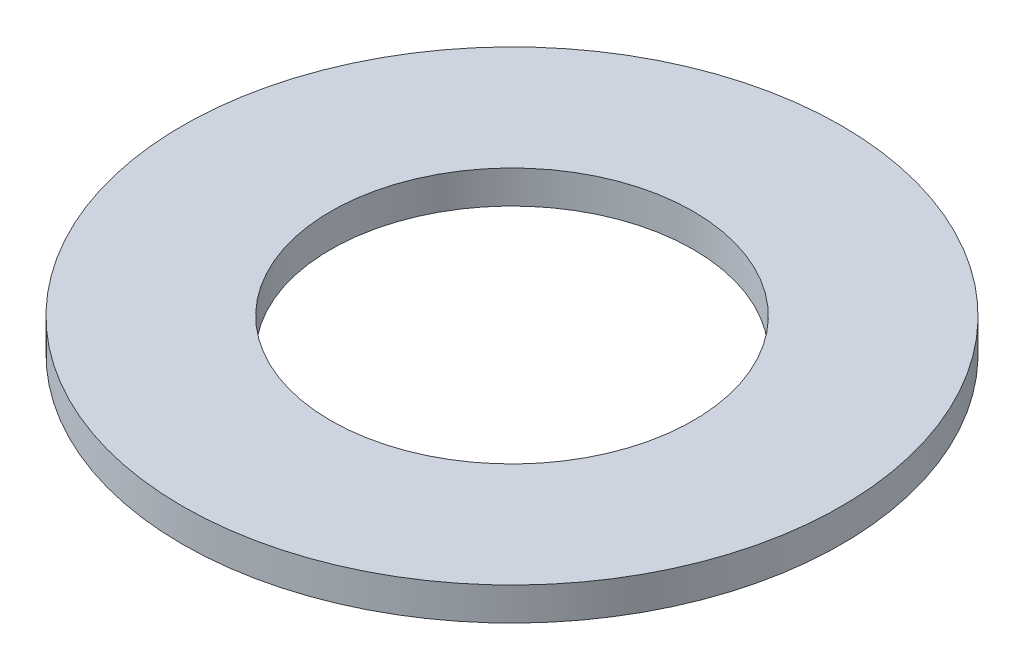
ISO-10303-21;
HEADER;
FILE_DESCRIPTION(('STEP AP214'),'2;1');
FILE_NAME('part.step','',(''),(''),'','','');
FILE_SCHEMA(('AUTOMOTIVE_DESIGN { 1 0 10303 214 1 1 1 1 }'));
ENDSEC;
DATA;
#1=APPLICATION_CONTEXT('core data for automotive mechanical design processes');
#2=APPLICATION_PROTOCOL_DEFINITION('international standard','automotive_design',2000,#1);
#3=PRODUCT_CONTEXT('',#1,'mechanical');
#4=PRODUCT('Part','Part','',(#3));
#5=PRODUCT_RELATED_PRODUCT_CATEGORY('part','',(#4));
#6=PRODUCT_DEFINITION_FORMATION('','',#4);
#7=PRODUCT_DEFINITION_CONTEXT('part definition',#1,'design');
#8=PRODUCT_DEFINITION('design','',#6,#7);
#9=PRODUCT_DEFINITION_SHAPE('','',#8);
#10=(LENGTH_UNIT() NAMED_UNIT(*) SI_UNIT(.MILLI.,.METRE.));
#11=(NAMED_UNIT(*) PLANE_ANGLE_UNIT() SI_UNIT($,.RADIAN.));
#12=(NAMED_UNIT(*) SI_UNIT($,.STERADIAN.) SOLID_ANGLE_UNIT());
#13=UNCERTAINTY_MEASURE_WITH_UNIT(LENGTH_MEASURE(1.E-05),#10,'distance_accuracy_value','');
#14=(GEOMETRIC_REPRESENTATION_CONTEXT(3) GLOBAL_UNCERTAINTY_ASSIGNED_CONTEXT((#13)) GLOBAL_UNIT_ASSIGNED_CONTEXT((#10,
#11,#12)) REPRESENTATION_CONTEXT('',''));
#15=CARTESIAN_POINT('',(0.,0.,0.));
#16=DIRECTION('',(0.,0.,1.));
#17=DIRECTION('',(1.,0.,0.));
#18=AXIS2_PLACEMENT_3D('',#15,#16,#17);
#19=CARTESIAN_POINT('',(0.,2.,0.));
#20=DIRECTION('',(0.,1.,0.));
#21=DIRECTION('',(0.,0.,1.));
#22=AXIS2_PLACEMENT_3D('',#19,#20,#21);
#23=PLANE('',#22);
#24=CARTESIAN_POINT('',(0.,2.,0.));
#25=DIRECTION('',(0.,1.,0.));
#26=DIRECTION('',(0.,0.,1.));
#27=AXIS2_PLACEMENT_3D('',#24,#25,#26);
#28=CIRCLE('',#27,20.);
#29=CARTESIAN_POINT('',(0.,2.,20.));
#30=VERTEX_POINT('',#29);
#31=EDGE_CURVE('E10',#30,#30,#28,.T.);
#32=ORIENTED_EDGE('',*,*,#31,.T.);
#33=EDGE_LOOP('',(#32));
#34=FACE_BOUND('',#33,.T.);
#35=CARTESIAN_POINT('',(0.,2.,0.));
#36=DIRECTION('',(0.,1.,0.));
#37=DIRECTION('',(0.,0.,1.));
#38=AXIS2_PLACEMENT_3D('',#35,#36,#37);
#39=CIRCLE('',#38,11.);
#40=CARTESIAN_POINT('',(0.,2.,11.));
#41=VERTEX_POINT('',#40);
#42=EDGE_CURVE('E49',#41,#41,#39,.T.);
#43=ORIENTED_EDGE('',*,*,#42,.F.);
#44=EDGE_LOOP('',(#43));
#45=FACE_BOUND('',#44,.T.);
#46=ADVANCED_FACE('F39',(#34,#45),#23,.T.);
#47=CARTESIAN_POINT('',(0.,0.,0.));
#48=DIRECTION('',(0.,1.,0.));
#49=DIRECTION('',(0.,0.,1.));
#50=AXIS2_PLACEMENT_3D('',#47,#48,#49);
#51=PLANE('',#50);
#52=CARTESIAN_POINT('',(0.,0.,0.));
#53=DIRECTION('',(0.,1.,0.));
#54=DIRECTION('',(0.,0.,1.));
#55=AXIS2_PLACEMENT_3D('',#52,#53,#54);
#56=CIRCLE('',#55,20.);
#57=CARTESIAN_POINT('',(0.,0.,20.));
#58=VERTEX_POINT('',#57);
#59=EDGE_CURVE('E43',#58,#58,#56,.T.);
#60=ORIENTED_EDGE('',*,*,#59,.F.);
#61=EDGE_LOOP('',(#60));
#62=FACE_BOUND('',#61,.T.);
#63=CARTESIAN_POINT('',(0.,0.,0.));
#64=DIRECTION('',(0.,1.,0.));
#65=DIRECTION('',(0.,0.,1.));
#66=AXIS2_PLACEMENT_3D('',#63,#64,#65);
#67=CIRCLE('',#66,11.);
#68=CARTESIAN_POINT('',(0.,0.,11.));
#69=VERTEX_POINT('',#68);
#70=EDGE_CURVE('E55',#69,#69,#67,.T.);
#71=ORIENTED_EDGE('',*,*,#70,.T.);
#72=EDGE_LOOP('',(#71));
#73=FACE_BOUND('',#72,.T.);
#74=ADVANCED_FACE('F62',(#62,#73),#51,.F.);
#75=CARTESIAN_POINT('',(0.,2.,0.));
#76=DIRECTION('',(0.,-1.,0.));
#77=DIRECTION('',(0.,0.,-1.));
#78=AXIS2_PLACEMENT_3D('',#75,#76,#77);
#79=CYLINDRICAL_SURFACE('',#78,20.);
#80=ORIENTED_EDGE('',*,*,#31,.F.);
#81=EDGE_LOOP('',(#80));
#82=FACE_BOUND('',#81,.T.);
#83=ORIENTED_EDGE('',*,*,#59,.T.);
#84=EDGE_LOOP('',(#83));
#85=FACE_BOUND('',#84,.T.);
#86=ADVANCED_FACE('F41',(#82,#85),#79,.T.);
#87=CARTESIAN_POINT('',(0.,2.,0.));
#88=DIRECTION('',(0.,-1.,0.));
#89=DIRECTION('',(0.,0.,-1.));
#90=AXIS2_PLACEMENT_3D('',#87,#88,#89);
#91=CYLINDRICAL_SURFACE('',#90,11.);
#92=ORIENTED_EDGE('',*,*,#42,.T.);
#93=EDGE_LOOP('',(#92));
#94=FACE_BOUND('',#93,.T.);
#95=ORIENTED_EDGE('',*,*,#70,.F.);
#96=EDGE_LOOP('',(#95));
#97=FACE_BOUND('',#96,.T.);
#98=ADVANCED_FACE('F59',(#94,#97),#91,.F.);
#99=CLOSED_SHELL('',(#46,#74,#86,#98));
#100=MANIFOLD_SOLID_BREP('B2',#99);
#101=ADVANCED_BREP_SHAPE_REPRESENTATION('',(#18,#100),#14);
#102=SHAPE_DEFINITION_REPRESENTATION(#9,#101);
ENDSEC;
END-ISO-10303-21;
